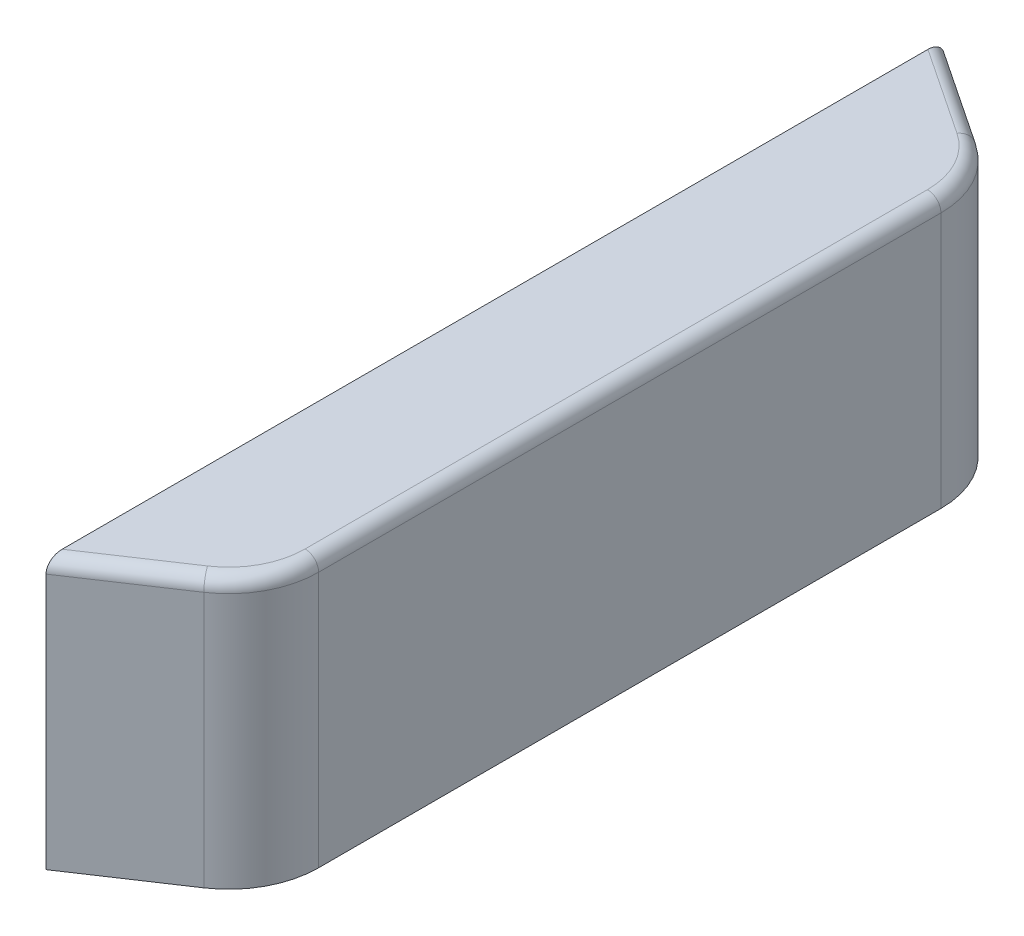
ISO-10303-21;
HEADER;
FILE_DESCRIPTION(('STEP AP214'),'2;1');
FILE_NAME('part.step','',(''),(''),'','','');
FILE_SCHEMA(('AUTOMOTIVE_DESIGN { 1 0 10303 214 1 1 1 1 }'));
ENDSEC;
DATA;
#1=APPLICATION_CONTEXT('core data for automotive mechanical design processes');
#2=APPLICATION_PROTOCOL_DEFINITION('international standard','automotive_design',2000,#1);
#3=PRODUCT_CONTEXT('',#1,'mechanical');
#4=PRODUCT('Part','Part','',(#3));
#5=PRODUCT_RELATED_PRODUCT_CATEGORY('part','',(#4));
#6=PRODUCT_DEFINITION_FORMATION('','',#4);
#7=PRODUCT_DEFINITION_CONTEXT('part definition',#1,'design');
#8=PRODUCT_DEFINITION('design','',#6,#7);
#9=PRODUCT_DEFINITION_SHAPE('','',#8);
#10=(LENGTH_UNIT() NAMED_UNIT(*) SI_UNIT(.MILLI.,.METRE.));
#11=(NAMED_UNIT(*) PLANE_ANGLE_UNIT() SI_UNIT($,.RADIAN.));
#12=(NAMED_UNIT(*) SI_UNIT($,.STERADIAN.) SOLID_ANGLE_UNIT());
#13=UNCERTAINTY_MEASURE_WITH_UNIT(LENGTH_MEASURE(1.E-05),#10,'distance_accuracy_value','');
#14=(GEOMETRIC_REPRESENTATION_CONTEXT(3) GLOBAL_UNCERTAINTY_ASSIGNED_CONTEXT((#13)) GLOBAL_UNIT_ASSIGNED_CONTEXT((#10,
#11,#12)) REPRESENTATION_CONTEXT('',''));
#15=CARTESIAN_POINT('',(0.,0.,0.));
#16=DIRECTION('',(0.,0.,1.));
#17=DIRECTION('',(1.,0.,0.));
#18=AXIS2_PLACEMENT_3D('',#15,#16,#17);
#19=CARTESIAN_POINT('',(4.99999999999999,0.,-34.64816241512));
#20=DIRECTION('',(0.,-1.,0.));
#21=DIRECTION('',(0.,0.,-1.));
#22=AXIS2_PLACEMENT_3D('',#19,#20,#21);
#23=PLANE('',#22);
#24=DIRECTION('',(-0.832050294337844,0.,-0.554700196225229));
#25=VECTOR('',#24,1.);
#26=CARTESIAN_POINT('',(0.,0.,-50.));
#27=LINE('',#26,#25);
#28=CARTESIAN_POINT('',(10.5470019622523,0.,-42.9686653584985));
#29=VERTEX_POINT('',#28);
#30=CARTESIAN_POINT('',(0.,0.,-50.));
#31=VERTEX_POINT('',#30);
#32=EDGE_CURVE('E217',#29,#31,#27,.T.);
#33=ORIENTED_EDGE('',*,*,#32,.F.);
#34=CARTESIAN_POINT('',(4.99999999999999,0.,-34.64816241512));
#35=DIRECTION('',(0.,1.,0.));
#36=DIRECTION('',(0.,0.,-1.));
#37=AXIS2_PLACEMENT_3D('',#34,#35,#36);
#38=CIRCLE('',#37,10.);
#39=CARTESIAN_POINT('',(15.,0.,-34.64816241512));
#40=VERTEX_POINT('',#39);
#41=EDGE_CURVE('E216',#40,#29,#38,.T.);
#42=ORIENTED_EDGE('',*,*,#41,.F.);
#43=DIRECTION('',(0.,0.,-1.));
#44=VECTOR('',#43,1.);
#45=CARTESIAN_POINT('',(15.,0.,34.64816241512));
#46=LINE('',#45,#44);
#47=CARTESIAN_POINT('',(15.,0.,34.64816241512));
#48=VERTEX_POINT('',#47);
#49=EDGE_CURVE('E230',#48,#40,#46,.T.);
#50=ORIENTED_EDGE('',*,*,#49,.F.);
#51=CARTESIAN_POINT('',(5.,0.,34.64816241512));
#52=DIRECTION('',(0.,1.,0.));
#53=DIRECTION('',(0.,0.,1.));
#54=AXIS2_PLACEMENT_3D('',#51,#52,#53);
#55=CIRCLE('',#54,10.);
#56=CARTESIAN_POINT('',(10.5470019622523,0.,42.9686653584985));
#57=VERTEX_POINT('',#56);
#58=EDGE_CURVE('E227',#57,#48,#55,.T.);
#59=ORIENTED_EDGE('',*,*,#58,.F.);
#60=DIRECTION('',(0.832050294337844,0.,-0.554700196225228));
#61=VECTOR('',#60,1.);
#62=CARTESIAN_POINT('',(10.5470019622523,0.,42.9686653584985));
#63=LINE('',#62,#61);
#64=CARTESIAN_POINT('',(0.,0.,50.));
#65=VERTEX_POINT('',#64);
#66=EDGE_CURVE('E224',#65,#57,#63,.T.);
#67=ORIENTED_EDGE('',*,*,#66,.F.);
#68=DIRECTION('',(0.,0.,1.));
#69=VECTOR('',#68,1.);
#70=CARTESIAN_POINT('',(0.,0.,50.));
#71=LINE('',#70,#69);
#72=EDGE_CURVE('E220',#31,#65,#71,.T.);
#73=ORIENTED_EDGE('',*,*,#72,.F.);
#74=EDGE_LOOP('',(#33,#42,#50,#59,#67,#73));
#75=FACE_BOUND('',#74,.T.);
#76=CARTESIAN_POINT('',(4.99999999999999,0.,-34.64816241512));
#77=DIRECTION('',(0.,-1.,0.));
#78=DIRECTION('',(0.,0.,-1.));
#79=AXIS2_PLACEMENT_3D('',#76,#77,#78);
#80=CIRCLE('',#79,8.50000000000001);
#81=CARTESIAN_POINT('',(13.5,0.,-34.64816241512));
#82=VERTEX_POINT('',#81);
#83=CARTESIAN_POINT('',(9.71495166791444,0.,-41.7205899169917));
#84=VERTEX_POINT('',#83);
#85=EDGE_CURVE('E180',#82,#84,#80,.F.);
#86=ORIENTED_EDGE('',*,*,#85,.T.);
#87=DIRECTION('',(-0.832050294337844,0.,-0.554700196225229));
#88=VECTOR('',#87,1.);
#89=CARTESIAN_POINT('',(9.71495166791444,0.,-41.7205899169917));
#90=LINE('',#89,#88);
#91=CARTESIAN_POINT('',(4.60940039245046,0.,-45.124290767301));
#92=VERTEX_POINT('',#91);
#93=EDGE_CURVE('E189',#84,#92,#90,.T.);
#94=ORIENTED_EDGE('',*,*,#93,.T.);
#95=CARTESIAN_POINT('',(3.5,0.,-43.4601901786254));
#96=DIRECTION('',(0.,-1.,0.));
#97=DIRECTION('',(0.,0.,-1.));
#98=AXIS2_PLACEMENT_3D('',#95,#96,#97);
#99=CIRCLE('',#98,2.);
#100=CARTESIAN_POINT('',(1.5,0.,-43.4601901786254));
#101=VERTEX_POINT('',#100);
#102=EDGE_CURVE('E278',#92,#101,#99,.F.);
#103=ORIENTED_EDGE('',*,*,#102,.T.);
#104=DIRECTION('',(0.,0.,1.));
#105=VECTOR('',#104,1.);
#106=CARTESIAN_POINT('',(1.5,0.,-34.64816241512));
#107=LINE('',#106,#105);
#108=CARTESIAN_POINT('',(1.5,0.,43.4601901786253));
#109=VERTEX_POINT('',#108);
#110=EDGE_CURVE('E195',#101,#109,#107,.T.);
#111=ORIENTED_EDGE('',*,*,#110,.T.);
#112=CARTESIAN_POINT('',(3.5,0.,43.4601901786254));
#113=DIRECTION('',(0.,-1.,0.));
#114=DIRECTION('',(0.,0.,-1.));
#115=AXIS2_PLACEMENT_3D('',#112,#113,#114);
#116=CIRCLE('',#115,2.);
#117=CARTESIAN_POINT('',(4.60940039245045,0.,45.1242907673011));
#118=VERTEX_POINT('',#117);
#119=EDGE_CURVE('E280',#109,#118,#116,.F.);
#120=ORIENTED_EDGE('',*,*,#119,.T.);
#121=DIRECTION('',(0.832050294337844,0.,-0.554700196225228));
#122=VECTOR('',#121,1.);
#123=CARTESIAN_POINT('',(41.6978708203329,0.,20.3986438153795));
#124=LINE('',#123,#122);
#125=CARTESIAN_POINT('',(9.71495166791446,0.,41.7205899169917));
#126=VERTEX_POINT('',#125);
#127=EDGE_CURVE('E207',#118,#126,#124,.T.);
#128=ORIENTED_EDGE('',*,*,#127,.T.);
#129=CARTESIAN_POINT('',(5.,0.,34.64816241512));
#130=DIRECTION('',(0.,-1.,0.));
#131=DIRECTION('',(0.,0.,-1.));
#132=AXIS2_PLACEMENT_3D('',#129,#130,#131);
#133=CIRCLE('',#132,8.50000000000001);
#134=CARTESIAN_POINT('',(13.5,0.,34.64816241512));
#135=VERTEX_POINT('',#134);
#136=EDGE_CURVE('E202',#126,#135,#133,.F.);
#137=ORIENTED_EDGE('',*,*,#136,.T.);
#138=DIRECTION('',(0.,0.,-1.));
#139=VECTOR('',#138,1.);
#140=CARTESIAN_POINT('',(13.5,0.,-34.64816241512));
#141=LINE('',#140,#139);
#142=EDGE_CURVE('E200',#135,#82,#141,.T.);
#143=ORIENTED_EDGE('',*,*,#142,.T.);
#144=EDGE_LOOP('',(#86,#94,#103,#111,#120,#128,#137,#143));
#145=FACE_BOUND('',#144,.T.);
#146=ADVANCED_FACE('F37',(#75,#145),#23,.T.);
#147=CARTESIAN_POINT('',(0.,30.,-50.));
#148=DIRECTION('',(-0.554700196225229,0.,0.832050294337844));
#149=DIRECTION('',(0.832050294337844,0.,0.554700196225229));
#150=AXIS2_PLACEMENT_3D('',#147,#148,#149);
#151=PLANE('',#150);
#152=DIRECTION('',(0.,-1.,0.));
#153=VECTOR('',#152,1.);
#154=CARTESIAN_POINT('',(0.,30.,-50.));
#155=LINE('',#154,#153);
#156=CARTESIAN_POINT('',(0.,28.5,-50.));
#157=VERTEX_POINT('',#156);
#158=EDGE_CURVE('E244',#157,#31,#155,.T.);
#159=ORIENTED_EDGE('',*,*,#158,.F.);
#160=DIRECTION('',(-0.832050294337844,0.,-0.554700196225229));
#161=VECTOR('',#160,1.);
#162=CARTESIAN_POINT('',(0.,28.5,-50.));
#163=LINE('',#162,#161);
#164=CARTESIAN_POINT('',(10.5470019622523,28.5,-42.9686653584985));
#165=VERTEX_POINT('',#164);
#166=EDGE_CURVE('E61',#157,#165,#163,.F.);
#167=ORIENTED_EDGE('',*,*,#166,.T.);
#168=DIRECTION('',(0.,-1.,0.));
#169=VECTOR('',#168,1.);
#170=CARTESIAN_POINT('',(10.5470019622523,30.,-42.9686653584985));
#171=LINE('',#170,#169);
#172=EDGE_CURVE('E215',#165,#29,#171,.T.);
#173=ORIENTED_EDGE('',*,*,#172,.T.);
#174=ORIENTED_EDGE('',*,*,#32,.T.);
#175=EDGE_LOOP('',(#159,#167,#173,#174));
#176=FACE_BOUND('',#175,.T.);
#177=ADVANCED_FACE('F382',(#176),#151,.F.);
#178=CARTESIAN_POINT('',(0.,30.,50.));
#179=DIRECTION('',(1.,0.,0.));
#180=DIRECTION('',(0.,0.,-1.));
#181=AXIS2_PLACEMENT_3D('',#178,#179,#180);
#182=PLANE('',#181);
#183=DIRECTION('',(0.,-1.,0.));
#184=VECTOR('',#183,1.);
#185=CARTESIAN_POINT('',(0.,30.,50.));
#186=LINE('',#185,#184);
#187=CARTESIAN_POINT('',(0.,28.5,50.));
#188=VERTEX_POINT('',#187);
#189=EDGE_CURVE('E242',#188,#65,#186,.T.);
#190=ORIENTED_EDGE('',*,*,#189,.F.);
#191=CARTESIAN_POINT('',(0.,28.5,48.197224362268));
#192=DIRECTION('',(1.,0.,0.));
#193=DIRECTION('',(0.,0.,-1.));
#194=AXIS2_PLACEMENT_3D('',#191,#192,#193);
#195=ELLIPSE('',#194,1.80277563773199,1.5);
#196=CARTESIAN_POINT('',(0.,30.,48.197224362268));
#197=VERTEX_POINT('',#196);
#198=EDGE_CURVE('E324',#188,#197,#195,.F.);
#199=ORIENTED_EDGE('',*,*,#198,.T.);
#200=DIRECTION('',(0.,0.,1.));
#201=VECTOR('',#200,1.);
#202=CARTESIAN_POINT('',(0.,30.,50.));
#203=LINE('',#202,#201);
#204=CARTESIAN_POINT('',(0.,30.,-48.197224362268));
#205=VERTEX_POINT('',#204);
#206=EDGE_CURVE('E212',#205,#197,#203,.T.);
#207=ORIENTED_EDGE('',*,*,#206,.F.);
#208=CARTESIAN_POINT('',(0.,28.5,-48.197224362268));
#209=DIRECTION('',(1.,0.,0.));
#210=DIRECTION('',(0.,0.,-1.));
#211=AXIS2_PLACEMENT_3D('',#208,#209,#210);
#212=ELLIPSE('',#211,1.80277563773199,1.5);
#213=EDGE_CURVE('E322',#205,#157,#212,.F.);
#214=ORIENTED_EDGE('',*,*,#213,.T.);
#215=ORIENTED_EDGE('',*,*,#158,.T.);
#216=ORIENTED_EDGE('',*,*,#72,.T.);
#217=EDGE_LOOP('',(#190,#199,#207,#214,#215,#216));
#218=FACE_BOUND('',#217,.T.);
#219=ADVANCED_FACE('F354',(#218),#182,.F.);
#220=CARTESIAN_POINT('',(10.5470019622523,30.,42.9686653584985));
#221=DIRECTION('',(-0.554700196225228,0.,-0.832050294337844));
#222=DIRECTION('',(-0.832050294337844,0.,0.554700196225228));
#223=AXIS2_PLACEMENT_3D('',#220,#221,#222);
#224=PLANE('',#223);
#225=DIRECTION('',(0.,-1.,0.));
#226=VECTOR('',#225,1.);
#227=CARTESIAN_POINT('',(10.5470019622523,30.,42.9686653584985));
#228=LINE('',#227,#226);
#229=CARTESIAN_POINT('',(10.5470019622523,28.5,42.9686653584985));
#230=VERTEX_POINT('',#229);
#231=EDGE_CURVE('E240',#230,#57,#228,.T.);
#232=ORIENTED_EDGE('',*,*,#231,.F.);
#233=DIRECTION('',(0.832050294337844,0.,-0.554700196225228));
#234=VECTOR('',#233,1.);
#235=CARTESIAN_POINT('',(10.5470019622523,28.5,42.9686653584985));
#236=LINE('',#235,#234);
#237=EDGE_CURVE('E320',#230,#188,#236,.F.);
#238=ORIENTED_EDGE('',*,*,#237,.T.);
#239=ORIENTED_EDGE('',*,*,#189,.T.);
#240=ORIENTED_EDGE('',*,*,#66,.T.);
#241=EDGE_LOOP('',(#232,#238,#239,#240));
#242=FACE_BOUND('',#241,.T.);
#243=ADVANCED_FACE('F371',(#242),#224,.F.);
#244=CARTESIAN_POINT('',(5.,30.,34.64816241512));
#245=DIRECTION('',(0.,-1.,0.));
#246=DIRECTION('',(0.,0.,-1.));
#247=AXIS2_PLACEMENT_3D('',#244,#245,#246);
#248=CYLINDRICAL_SURFACE('',#247,10.);
#249=DIRECTION('',(0.,-1.,0.));
#250=VECTOR('',#249,1.);
#251=CARTESIAN_POINT('',(15.,30.,34.64816241512));
#252=LINE('',#251,#250);
#253=CARTESIAN_POINT('',(15.,28.5,34.64816241512));
#254=VERTEX_POINT('',#253);
#255=EDGE_CURVE('E238',#254,#48,#252,.T.);
#256=ORIENTED_EDGE('',*,*,#255,.F.);
#257=CARTESIAN_POINT('',(5.,28.5,34.64816241512));
#258=DIRECTION('',(0.,-1.,0.));
#259=DIRECTION('',(0.,0.,-1.));
#260=AXIS2_PLACEMENT_3D('',#257,#258,#259);
#261=CIRCLE('',#260,10.);
#262=EDGE_CURVE('E326',#254,#230,#261,.T.);
#263=ORIENTED_EDGE('',*,*,#262,.T.);
#264=ORIENTED_EDGE('',*,*,#231,.T.);
#265=ORIENTED_EDGE('',*,*,#58,.T.);
#266=EDGE_LOOP('',(#256,#263,#264,#265));
#267=FACE_BOUND('',#266,.T.);
#268=ADVANCED_FACE('F369',(#267),#248,.T.);
#269=CARTESIAN_POINT('',(15.,30.,34.64816241512));
#270=DIRECTION('',(-1.,0.,0.));
#271=DIRECTION('',(0.,0.,1.));
#272=AXIS2_PLACEMENT_3D('',#269,#270,#271);
#273=PLANE('',#272);
#274=DIRECTION('',(0.,-1.,0.));
#275=VECTOR('',#274,1.);
#276=CARTESIAN_POINT('',(15.,30.,-34.64816241512));
#277=LINE('',#276,#275);
#278=CARTESIAN_POINT('',(15.,28.5,-34.64816241512));
#279=VERTEX_POINT('',#278);
#280=EDGE_CURVE('E236',#279,#40,#277,.T.);
#281=ORIENTED_EDGE('',*,*,#280,.F.);
#282=DIRECTION('',(0.,0.,-1.));
#283=VECTOR('',#282,1.);
#284=CARTESIAN_POINT('',(15.,28.5,34.64816241512));
#285=LINE('',#284,#283);
#286=EDGE_CURVE('E11',#279,#254,#285,.F.);
#287=ORIENTED_EDGE('',*,*,#286,.T.);
#288=ORIENTED_EDGE('',*,*,#255,.T.);
#289=ORIENTED_EDGE('',*,*,#49,.T.);
#290=EDGE_LOOP('',(#281,#287,#288,#289));
#291=FACE_BOUND('',#290,.T.);
#292=ADVANCED_FACE('F380',(#291),#273,.F.);
#293=CARTESIAN_POINT('',(4.99999999999999,30.,-34.64816241512));
#294=DIRECTION('',(0.,-1.,0.));
#295=DIRECTION('',(0.,0.,-1.));
#296=AXIS2_PLACEMENT_3D('',#293,#294,#295);
#297=CYLINDRICAL_SURFACE('',#296,10.);
#298=ORIENTED_EDGE('',*,*,#172,.F.);
#299=CARTESIAN_POINT('',(4.99999999999999,28.5,-34.64816241512));
#300=DIRECTION('',(0.,-1.,0.));
#301=DIRECTION('',(0.,0.,-1.));
#302=AXIS2_PLACEMENT_3D('',#299,#300,#301);
#303=CIRCLE('',#302,10.);
#304=EDGE_CURVE('E46',#165,#279,#303,.T.);
#305=ORIENTED_EDGE('',*,*,#304,.T.);
#306=ORIENTED_EDGE('',*,*,#280,.T.);
#307=ORIENTED_EDGE('',*,*,#41,.T.);
#308=EDGE_LOOP('',(#298,#305,#306,#307));
#309=FACE_BOUND('',#308,.T.);
#310=ADVANCED_FACE('F381',(#309),#297,.T.);
#311=CARTESIAN_POINT('',(4.99999999999999,30.,-34.64816241512));
#312=DIRECTION('',(0.,-1.,0.));
#313=DIRECTION('',(0.,0.,-1.));
#314=AXIS2_PLACEMENT_3D('',#311,#312,#313);
#315=PLANE('',#314);
#316=ORIENTED_EDGE('',*,*,#206,.T.);
#317=DIRECTION('',(0.832050294337844,0.,-0.554700196225228));
#318=VECTOR('',#317,1.);
#319=CARTESIAN_POINT('',(41.6978708203329,30.,20.3986438153795));
#320=LINE('',#319,#318);
#321=CARTESIAN_POINT('',(9.71495166791446,30.,41.7205899169917));
#322=VERTEX_POINT('',#321);
#323=EDGE_CURVE('E317',#197,#322,#320,.T.);
#324=ORIENTED_EDGE('',*,*,#323,.T.);
#325=CARTESIAN_POINT('',(5.,30.,34.64816241512));
#326=DIRECTION('',(0.,-1.,0.));
#327=DIRECTION('',(0.,0.,-1.));
#328=AXIS2_PLACEMENT_3D('',#325,#326,#327);
#329=CIRCLE('',#328,8.50000000000001);
#330=CARTESIAN_POINT('',(13.5,30.,34.64816241512));
#331=VERTEX_POINT('',#330);
#332=EDGE_CURVE('E315',#322,#331,#329,.F.);
#333=ORIENTED_EDGE('',*,*,#332,.T.);
#334=DIRECTION('',(0.,0.,-1.));
#335=VECTOR('',#334,1.);
#336=CARTESIAN_POINT('',(13.5,30.,-34.64816241512));
#337=LINE('',#336,#335);
#338=CARTESIAN_POINT('',(13.5,30.,-34.64816241512));
#339=VERTEX_POINT('',#338);
#340=EDGE_CURVE('E282',#331,#339,#337,.T.);
#341=ORIENTED_EDGE('',*,*,#340,.T.);
#342=CARTESIAN_POINT('',(4.99999999999999,30.,-34.64816241512));
#343=DIRECTION('',(0.,-1.,0.));
#344=DIRECTION('',(0.,0.,-1.));
#345=AXIS2_PLACEMENT_3D('',#342,#343,#344);
#346=CIRCLE('',#345,8.50000000000001);
#347=CARTESIAN_POINT('',(9.71495166791444,30.,-41.7205899169917));
#348=VERTEX_POINT('',#347);
#349=EDGE_CURVE('E311',#339,#348,#346,.F.);
#350=ORIENTED_EDGE('',*,*,#349,.T.);
#351=DIRECTION('',(-0.832050294337844,0.,-0.554700196225229));
#352=VECTOR('',#351,1.);
#353=CARTESIAN_POINT('',(9.71495166791444,30.,-41.7205899169917));
#354=LINE('',#353,#352);
#355=EDGE_CURVE('E313',#348,#205,#354,.T.);
#356=ORIENTED_EDGE('',*,*,#355,.T.);
#357=EDGE_LOOP('',(#316,#324,#333,#341,#350,#356));
#358=FACE_BOUND('',#357,.T.);
#359=ADVANCED_FACE('F350',(#358),#315,.F.);
#360=CARTESIAN_POINT('',(-0.832050294337844,30.,-48.7519245584932));
#361=DIRECTION('',(-0.554700196225229,0.,0.832050294337844));
#362=DIRECTION('',(0.832050294337844,0.,0.554700196225229));
#363=AXIS2_PLACEMENT_3D('',#360,#361,#362);
#364=PLANE('',#363);
#365=DIRECTION('',(0.,1.,0.));
#366=VECTOR('',#365,1.);
#367=CARTESIAN_POINT('',(9.71495166791445,30.,-41.7205899169917));
#368=LINE('',#367,#366);
#369=CARTESIAN_POINT('',(9.71495166791445,26.5,-41.7205899169917));
#370=VERTEX_POINT('',#369);
#371=EDGE_CURVE('E175',#370,#84,#368,.F.);
#372=ORIENTED_EDGE('',*,*,#371,.F.);
#373=DIRECTION('',(-0.832050294337844,0.,-0.554700196225229));
#374=VECTOR('',#373,1.);
#375=CARTESIAN_POINT('',(1.5,26.5,-47.197224362268));
#376=LINE('',#375,#374);
#377=CARTESIAN_POINT('',(4.60940039245046,26.5,-45.124290767301));
#378=VERTEX_POINT('',#377);
#379=EDGE_CURVE('E276',#370,#378,#376,.T.);
#380=ORIENTED_EDGE('',*,*,#379,.T.);
#381=DIRECTION('',(0.,-1.,0.));
#382=VECTOR('',#381,1.);
#383=CARTESIAN_POINT('',(4.60940039245046,0.,-45.124290767301));
#384=LINE('',#383,#382);
#385=EDGE_CURVE('E192',#378,#92,#384,.T.);
#386=ORIENTED_EDGE('',*,*,#385,.T.);
#387=ORIENTED_EDGE('',*,*,#93,.F.);
#388=EDGE_LOOP('',(#372,#380,#386,#387));
#389=FACE_BOUND('',#388,.T.);
#390=ADVANCED_FACE('F190',(#389),#364,.T.);
#391=CARTESIAN_POINT('',(1.5,30.,50.));
#392=DIRECTION('',(1.,0.,0.));
#393=DIRECTION('',(0.,0.,-1.));
#394=AXIS2_PLACEMENT_3D('',#391,#392,#393);
#395=PLANE('',#394);
#396=ORIENTED_EDGE('',*,*,#110,.F.);
#397=DIRECTION('',(0.,-1.,0.));
#398=VECTOR('',#397,1.);
#399=CARTESIAN_POINT('',(1.5,28.5,-43.4601901786254));
#400=LINE('',#399,#398);
#401=CARTESIAN_POINT('',(1.5,26.5,-43.4601901786254));
#402=VERTEX_POINT('',#401);
#403=EDGE_CURVE('E251',#101,#402,#400,.F.);
#404=ORIENTED_EDGE('',*,*,#403,.T.);
#405=DIRECTION('',(0.,0.,1.));
#406=VECTOR('',#405,1.);
#407=CARTESIAN_POINT('',(1.5,26.5,47.197224362268));
#408=LINE('',#407,#406);
#409=CARTESIAN_POINT('',(1.5,26.5,43.4601901786254));
#410=VERTEX_POINT('',#409);
#411=EDGE_CURVE('E248',#402,#410,#408,.T.);
#412=ORIENTED_EDGE('',*,*,#411,.T.);
#413=DIRECTION('',(0.,-1.,0.));
#414=VECTOR('',#413,1.);
#415=CARTESIAN_POINT('',(1.5,0.,43.4601901786254));
#416=LINE('',#415,#414);
#417=EDGE_CURVE('E246',#410,#109,#416,.T.);
#418=ORIENTED_EDGE('',*,*,#417,.T.);
#419=EDGE_LOOP('',(#396,#404,#412,#418));
#420=FACE_BOUND('',#419,.T.);
#421=ADVANCED_FACE('F522',(#420),#395,.T.);
#422=CARTESIAN_POINT('',(9.71495166791446,30.,41.7205899169917));
#423=DIRECTION('',(-0.554700196225228,0.,-0.832050294337844));
#424=DIRECTION('',(-0.832050294337844,0.,0.554700196225228));
#425=AXIS2_PLACEMENT_3D('',#422,#423,#424);
#426=PLANE('',#425);
#427=DIRECTION('',(0.,-1.,0.));
#428=VECTOR('',#427,1.);
#429=CARTESIAN_POINT('',(4.60940039245046,28.5,45.124290767301));
#430=LINE('',#429,#428);
#431=CARTESIAN_POINT('',(4.60940039245046,26.5,45.124290767301));
#432=VERTEX_POINT('',#431);
#433=EDGE_CURVE('E266',#118,#432,#430,.F.);
#434=ORIENTED_EDGE('',*,*,#433,.T.);
#435=DIRECTION('',(0.832050294337844,0.,-0.554700196225228));
#436=VECTOR('',#435,1.);
#437=CARTESIAN_POINT('',(9.71495166791446,26.5,41.7205899169917));
#438=LINE('',#437,#436);
#439=CARTESIAN_POINT('',(9.71495166791446,26.5,41.7205899169917));
#440=VERTEX_POINT('',#439);
#441=EDGE_CURVE('E268',#432,#440,#438,.T.);
#442=ORIENTED_EDGE('',*,*,#441,.T.);
#443=DIRECTION('',(0.,-1.,0.));
#444=VECTOR('',#443,1.);
#445=CARTESIAN_POINT('',(9.71495166791446,30.,41.7205899169917));
#446=LINE('',#445,#444);
#447=EDGE_CURVE('E221',#440,#126,#446,.T.);
#448=ORIENTED_EDGE('',*,*,#447,.T.);
#449=ORIENTED_EDGE('',*,*,#127,.F.);
#450=EDGE_LOOP('',(#434,#442,#448,#449));
#451=FACE_BOUND('',#450,.T.);
#452=ADVANCED_FACE('F514',(#451),#426,.T.);
#453=CARTESIAN_POINT('',(5.,30.,34.64816241512));
#454=DIRECTION('',(0.,-1.,0.));
#455=DIRECTION('',(0.,0.,-1.));
#456=AXIS2_PLACEMENT_3D('',#453,#454,#455);
#457=CYLINDRICAL_SURFACE('',#456,8.50000000000001);
#458=ORIENTED_EDGE('',*,*,#447,.F.);
#459=CARTESIAN_POINT('',(5.,26.5,34.64816241512));
#460=DIRECTION('',(0.,-1.,0.));
#461=DIRECTION('',(0.,0.,-1.));
#462=AXIS2_PLACEMENT_3D('',#459,#460,#461);
#463=CIRCLE('',#462,8.50000000000001);
#464=CARTESIAN_POINT('',(13.5,26.5,34.64816241512));
#465=VERTEX_POINT('',#464);
#466=EDGE_CURVE('E270',#440,#465,#463,.F.);
#467=ORIENTED_EDGE('',*,*,#466,.T.);
#468=DIRECTION('',(0.,1.,0.));
#469=VECTOR('',#468,1.);
#470=CARTESIAN_POINT('',(13.5,30.,34.64816241512));
#471=LINE('',#470,#469);
#472=EDGE_CURVE('E730',#465,#135,#471,.F.);
#473=ORIENTED_EDGE('',*,*,#472,.T.);
#474=ORIENTED_EDGE('',*,*,#136,.F.);
#475=EDGE_LOOP('',(#458,#467,#473,#474));
#476=FACE_BOUND('',#475,.T.);
#477=ADVANCED_FACE('F506',(#476),#457,.F.);
#478=CARTESIAN_POINT('',(13.5,30.,34.64816241512));
#479=DIRECTION('',(-1.,0.,0.));
#480=DIRECTION('',(0.,0.,1.));
#481=AXIS2_PLACEMENT_3D('',#478,#479,#480);
#482=PLANE('',#481);
#483=ORIENTED_EDGE('',*,*,#472,.F.);
#484=DIRECTION('',(0.,0.,-1.));
#485=VECTOR('',#484,1.);
#486=CARTESIAN_POINT('',(13.5,26.5,-34.64816241512));
#487=LINE('',#486,#485);
#488=CARTESIAN_POINT('',(13.5,26.5,-34.64816241512));
#489=VERTEX_POINT('',#488);
#490=EDGE_CURVE('E272',#465,#489,#487,.T.);
#491=ORIENTED_EDGE('',*,*,#490,.T.);
#492=DIRECTION('',(0.,-1.,0.));
#493=VECTOR('',#492,1.);
#494=CARTESIAN_POINT('',(13.5,30.,-34.64816241512));
#495=LINE('',#494,#493);
#496=EDGE_CURVE('E186',#489,#82,#495,.T.);
#497=ORIENTED_EDGE('',*,*,#496,.T.);
#498=ORIENTED_EDGE('',*,*,#142,.F.);
#499=EDGE_LOOP('',(#483,#491,#497,#498));
#500=FACE_BOUND('',#499,.T.);
#501=ADVANCED_FACE('F499',(#500),#482,.T.);
#502=CARTESIAN_POINT('',(4.99999999999999,30.,-34.64816241512));
#503=DIRECTION('',(0.,-1.,0.));
#504=DIRECTION('',(0.,0.,-1.));
#505=AXIS2_PLACEMENT_3D('',#502,#503,#504);
#506=CYLINDRICAL_SURFACE('',#505,8.50000000000001);
#507=ORIENTED_EDGE('',*,*,#496,.F.);
#508=CARTESIAN_POINT('',(4.99999999999999,26.5,-34.64816241512));
#509=DIRECTION('',(0.,-1.,0.));
#510=DIRECTION('',(0.,0.,-1.));
#511=AXIS2_PLACEMENT_3D('',#508,#509,#510);
#512=CIRCLE('',#511,8.50000000000001);
#513=EDGE_CURVE('E183',#489,#370,#512,.F.);
#514=ORIENTED_EDGE('',*,*,#513,.T.);
#515=ORIENTED_EDGE('',*,*,#371,.T.);
#516=ORIENTED_EDGE('',*,*,#85,.F.);
#517=EDGE_LOOP('',(#507,#514,#515,#516));
#518=FACE_BOUND('',#517,.T.);
#519=ADVANCED_FACE('F178',(#518),#506,.F.);
#520=CARTESIAN_POINT('',(4.99999999999999,28.5,-34.64816241512));
#521=DIRECTION('',(0.,-1.,0.));
#522=DIRECTION('',(0.,0.,-1.));
#523=AXIS2_PLACEMENT_3D('',#520,#521,#522);
#524=PLANE('',#523);
#525=DIRECTION('',(0.832050294337844,0.,-0.554700196225228));
#526=VECTOR('',#525,1.);
#527=CARTESIAN_POINT('',(0.390599607549542,28.5,45.5331237735923));
#528=LINE('',#527,#526);
#529=CARTESIAN_POINT('',(8.605551275464,28.5,40.056489328316));
#530=VERTEX_POINT('',#529);
#531=CARTESIAN_POINT('',(3.5,28.5,43.4601901786253));
#532=VERTEX_POINT('',#531);
#533=EDGE_CURVE('E261',#530,#532,#528,.F.);
#534=ORIENTED_EDGE('',*,*,#533,.T.);
#535=DIRECTION('',(0.,0.,1.));
#536=VECTOR('',#535,1.);
#537=CARTESIAN_POINT('',(3.5,28.5,-47.197224362268));
#538=LINE('',#537,#536);
#539=CARTESIAN_POINT('',(3.5,28.5,-43.4601901786254));
#540=VERTEX_POINT('',#539);
#541=EDGE_CURVE('E263',#532,#540,#538,.F.);
#542=ORIENTED_EDGE('',*,*,#541,.T.);
#543=DIRECTION('',(-0.832050294337844,0.,-0.554700196225229));
#544=VECTOR('',#543,1.);
#545=CARTESIAN_POINT('',(8.60555127546399,28.5,-40.056489328316));
#546=LINE('',#545,#544);
#547=CARTESIAN_POINT('',(8.60555127546399,28.5,-40.056489328316));
#548=VERTEX_POINT('',#547);
#549=EDGE_CURVE('E253',#540,#548,#546,.F.);
#550=ORIENTED_EDGE('',*,*,#549,.T.);
#551=CARTESIAN_POINT('',(4.99999999999999,28.5,-34.64816241512));
#552=DIRECTION('',(0.,-1.,0.));
#553=DIRECTION('',(0.,0.,-1.));
#554=AXIS2_PLACEMENT_3D('',#551,#552,#553);
#555=CIRCLE('',#554,6.50000000000001);
#556=CARTESIAN_POINT('',(11.5,28.5,-34.64816241512));
#557=VERTEX_POINT('',#556);
#558=EDGE_CURVE('E255',#548,#557,#555,.T.);
#559=ORIENTED_EDGE('',*,*,#558,.T.);
#560=DIRECTION('',(0.,0.,-1.));
#561=VECTOR('',#560,1.);
#562=CARTESIAN_POINT('',(11.5,28.5,34.64816241512));
#563=LINE('',#562,#561);
#564=CARTESIAN_POINT('',(11.5,28.5,34.64816241512));
#565=VERTEX_POINT('',#564);
#566=EDGE_CURVE('E257',#557,#565,#563,.F.);
#567=ORIENTED_EDGE('',*,*,#566,.T.);
#568=CARTESIAN_POINT('',(5.,28.5,34.64816241512));
#569=DIRECTION('',(0.,-1.,0.));
#570=DIRECTION('',(0.,0.,-1.));
#571=AXIS2_PLACEMENT_3D('',#568,#569,#570);
#572=CIRCLE('',#571,6.50000000000001);
#573=EDGE_CURVE('E259',#565,#530,#572,.T.);
#574=ORIENTED_EDGE('',*,*,#573,.T.);
#575=EDGE_LOOP('',(#534,#542,#550,#559,#567,#574));
#576=FACE_BOUND('',#575,.T.);
#577=ADVANCED_FACE('F432',(#576),#524,.T.);
#578=CARTESIAN_POINT('',(11.5,26.5,34.64816241512));
#579=DIRECTION('',(0.,0.,1.));
#580=DIRECTION('',(1.,0.,0.));
#581=AXIS2_PLACEMENT_3D('',#578,#579,#580);
#582=CYLINDRICAL_SURFACE('',#581,2.);
#583=CARTESIAN_POINT('',(11.5,26.5,34.64816241512));
#584=DIRECTION('',(0.,0.,-1.));
#585=DIRECTION('',(-1.,0.,0.));
#586=AXIS2_PLACEMENT_3D('',#583,#584,#585);
#587=CIRCLE('',#586,2.);
#588=EDGE_CURVE('E305',#565,#465,#587,.T.);
#589=ORIENTED_EDGE('',*,*,#588,.F.);
#590=ORIENTED_EDGE('',*,*,#566,.F.);
#591=CARTESIAN_POINT('',(11.5,26.5,-34.64816241512));
#592=DIRECTION('',(0.,0.,1.));
#593=DIRECTION('',(1.,0.,0.));
#594=AXIS2_PLACEMENT_3D('',#591,#592,#593);
#595=CIRCLE('',#594,2.);
#596=EDGE_CURVE('E196',#489,#557,#595,.T.);
#597=ORIENTED_EDGE('',*,*,#596,.F.);
#598=ORIENTED_EDGE('',*,*,#490,.F.);
#599=EDGE_LOOP('',(#589,#590,#597,#598));
#600=FACE_BOUND('',#599,.T.);
#601=ADVANCED_FACE('F428',(#600),#582,.F.);
#602=CARTESIAN_POINT('',(4.99999999999999,26.5,-34.64816241512));
#603=DIRECTION('',(0.,-1.,0.));
#604=DIRECTION('',(0.,0.,-1.));
#605=AXIS2_PLACEMENT_3D('',#602,#603,#604);
#606=TOROIDAL_SURFACE('',#605,6.50000000000001,2.);
#607=ORIENTED_EDGE('',*,*,#596,.T.);
#608=ORIENTED_EDGE('',*,*,#558,.F.);
#609=CARTESIAN_POINT('',(8.60555127546398,26.5,-40.056489328316));
#610=DIRECTION('',(0.832050294337843,0.,0.55470019622523));
#611=DIRECTION('',(0.55470019622523,0.,-0.832050294337843));
#612=AXIS2_PLACEMENT_3D('',#609,#610,#611);
#613=CIRCLE('',#612,2.);
#614=EDGE_CURVE('E302',#370,#548,#613,.T.);
#615=ORIENTED_EDGE('',*,*,#614,.F.);
#616=ORIENTED_EDGE('',*,*,#513,.F.);
#617=EDGE_LOOP('',(#607,#608,#615,#616));
#618=FACE_BOUND('',#617,.T.);
#619=ADVANCED_FACE('F424',(#618),#606,.F.);
#620=CARTESIAN_POINT('',(5.,26.5,34.64816241512));
#621=DIRECTION('',(0.,-1.,0.));
#622=DIRECTION('',(0.,0.,-1.));
#623=AXIS2_PLACEMENT_3D('',#620,#621,#622);
#624=TOROIDAL_SURFACE('',#623,6.50000000000001,2.);
#625=ORIENTED_EDGE('',*,*,#588,.T.);
#626=ORIENTED_EDGE('',*,*,#466,.F.);
#627=CARTESIAN_POINT('',(8.605551275464,26.5,40.056489328316));
#628=DIRECTION('',(0.832050294337844,0.,-0.554700196225229));
#629=DIRECTION('',(-0.554700196225229,0.,-0.832050294337844));
#630=AXIS2_PLACEMENT_3D('',#627,#628,#629);
#631=CIRCLE('',#630,2.);
#632=EDGE_CURVE('E299',#530,#440,#631,.T.);
#633=ORIENTED_EDGE('',*,*,#632,.F.);
#634=ORIENTED_EDGE('',*,*,#573,.F.);
#635=EDGE_LOOP('',(#625,#626,#633,#634));
#636=FACE_BOUND('',#635,.T.);
#637=ADVANCED_FACE('F420',(#636),#624,.F.);
#638=CARTESIAN_POINT('',(-1.9414506867883,26.5,-47.0878239698176));
#639=DIRECTION('',(0.832050294337844,0.,0.554700196225229));
#640=DIRECTION('',(0.554700196225229,0.,-0.832050294337844));
#641=AXIS2_PLACEMENT_3D('',#638,#639,#640);
#642=CYLINDRICAL_SURFACE('',#641,2.);
#643=ORIENTED_EDGE('',*,*,#614,.T.);
#644=ORIENTED_EDGE('',*,*,#549,.F.);
#645=CARTESIAN_POINT('',(3.5,26.5,-43.4601901786254));
#646=DIRECTION('',(0.832050294337843,0.,0.554700196225229));
#647=DIRECTION('',(0.554700196225229,0.,-0.832050294337844));
#648=AXIS2_PLACEMENT_3D('',#645,#646,#647);
#649=CIRCLE('',#648,2.);
#650=EDGE_CURVE('E296',#378,#540,#649,.T.);
#651=ORIENTED_EDGE('',*,*,#650,.F.);
#652=ORIENTED_EDGE('',*,*,#379,.F.);
#653=EDGE_LOOP('',(#643,#644,#651,#652));
#654=FACE_BOUND('',#653,.T.);
#655=ADVANCED_FACE('F416',(#654),#642,.F.);
#656=CARTESIAN_POINT('',(3.5,30.,-43.4601901786254));
#657=DIRECTION('',(0.,1.,0.));
#658=DIRECTION('',(0.,0.,1.));
#659=AXIS2_PLACEMENT_3D('',#656,#657,#658);
#660=CYLINDRICAL_SURFACE('',#659,2.);
#661=ORIENTED_EDGE('',*,*,#102,.F.);
#662=ORIENTED_EDGE('',*,*,#385,.F.);
#663=CARTESIAN_POINT('',(3.5,26.5,-43.4601901786254));
#664=DIRECTION('',(0.,-1.,0.));
#665=DIRECTION('',(0.,0.,-1.));
#666=AXIS2_PLACEMENT_3D('',#663,#664,#665);
#667=CIRCLE('',#666,2.);
#668=EDGE_CURVE('E293',#402,#378,#667,.T.);
#669=ORIENTED_EDGE('',*,*,#668,.F.);
#670=ORIENTED_EDGE('',*,*,#403,.F.);
#671=EDGE_LOOP('',(#661,#662,#669,#670));
#672=FACE_BOUND('',#671,.T.);
#673=ADVANCED_FACE('F412',(#672),#660,.F.);
#674=CARTESIAN_POINT('',(3.5,30.,43.4601901786254));
#675=DIRECTION('',(0.,1.,0.));
#676=DIRECTION('',(0.,0.,1.));
#677=AXIS2_PLACEMENT_3D('',#674,#675,#676);
#678=CYLINDRICAL_SURFACE('',#677,2.);
#679=ORIENTED_EDGE('',*,*,#119,.F.);
#680=ORIENTED_EDGE('',*,*,#417,.F.);
#681=CARTESIAN_POINT('',(3.5,26.5,43.4601901786254));
#682=DIRECTION('',(0.,-1.,0.));
#683=DIRECTION('',(0.,0.,-1.));
#684=AXIS2_PLACEMENT_3D('',#681,#682,#683);
#685=CIRCLE('',#684,2.);
#686=EDGE_CURVE('E290',#432,#410,#685,.T.);
#687=ORIENTED_EDGE('',*,*,#686,.F.);
#688=ORIENTED_EDGE('',*,*,#433,.F.);
#689=EDGE_LOOP('',(#679,#680,#687,#688));
#690=FACE_BOUND('',#689,.T.);
#691=ADVANCED_FACE('F408',(#690),#678,.F.);
#692=CARTESIAN_POINT('',(8.60555127546401,26.5,40.056489328316));
#693=DIRECTION('',(-0.832050294337844,0.,0.554700196225228));
#694=DIRECTION('',(0.554700196225228,0.,0.832050294337844));
#695=AXIS2_PLACEMENT_3D('',#692,#693,#694);
#696=CYLINDRICAL_SURFACE('',#695,2.);
#697=ORIENTED_EDGE('',*,*,#632,.T.);
#698=ORIENTED_EDGE('',*,*,#441,.F.);
#699=CARTESIAN_POINT('',(3.5,26.5,43.4601901786253));
#700=DIRECTION('',(0.832050294337845,0.,-0.554700196225226));
#701=DIRECTION('',(-0.554700196225226,0.,-0.832050294337846));
#702=AXIS2_PLACEMENT_3D('',#699,#700,#701);
#703=CIRCLE('',#702,2.);
#704=EDGE_CURVE('E287',#532,#432,#703,.T.);
#705=ORIENTED_EDGE('',*,*,#704,.F.);
#706=ORIENTED_EDGE('',*,*,#533,.F.);
#707=EDGE_LOOP('',(#697,#698,#705,#706));
#708=FACE_BOUND('',#707,.T.);
#709=ADVANCED_FACE('F404',(#708),#696,.F.);
#710=CARTESIAN_POINT('',(3.5,26.5,-43.4601901786254));
#711=DIRECTION('',(0.,1.,0.));
#712=DIRECTION('',(-1.,0.,0.));
#713=AXIS2_PLACEMENT_3D('',#710,#711,#712);
#714=SPHERICAL_SURFACE('',#713,2.);
#715=ORIENTED_EDGE('',*,*,#668,.T.);
#716=ORIENTED_EDGE('',*,*,#650,.T.);
#717=CARTESIAN_POINT('',(3.5,26.5,-43.4601901786254));
#718=DIRECTION('',(0.,0.,1.));
#719=DIRECTION('',(1.,0.,0.));
#720=AXIS2_PLACEMENT_3D('',#717,#718,#719);
#721=CIRCLE('',#720,2.);
#722=EDGE_CURVE('E285',#402,#540,#721,.F.);
#723=ORIENTED_EDGE('',*,*,#722,.F.);
#724=EDGE_LOOP('',(#715,#716,#723));
#725=FACE_BOUND('',#724,.T.);
#726=ADVANCED_FACE('F400',(#725),#714,.F.);
#727=CARTESIAN_POINT('',(3.5,26.5,43.4601901786254));
#728=DIRECTION('',(0.,1.,0.));
#729=DIRECTION('',(0.,0.,1.));
#730=AXIS2_PLACEMENT_3D('',#727,#728,#729);
#731=SPHERICAL_SURFACE('',#730,2.);
#732=ORIENTED_EDGE('',*,*,#704,.T.);
#733=ORIENTED_EDGE('',*,*,#686,.T.);
#734=CARTESIAN_POINT('',(3.5,26.5,43.4601901786254));
#735=DIRECTION('',(0.,0.,-1.));
#736=DIRECTION('',(0.,1.,0.));
#737=AXIS2_PLACEMENT_3D('',#734,#735,#736);
#738=CIRCLE('',#737,2.);
#739=EDGE_CURVE('E283',#532,#410,#738,.F.);
#740=ORIENTED_EDGE('',*,*,#739,.F.);
#741=EDGE_LOOP('',(#732,#733,#740));
#742=FACE_BOUND('',#741,.T.);
#743=ADVANCED_FACE('F396',(#742),#731,.F.);
#744=CARTESIAN_POINT('',(3.5,26.5,50.));
#745=DIRECTION('',(0.,0.,-1.));
#746=DIRECTION('',(-1.,0.,0.));
#747=AXIS2_PLACEMENT_3D('',#744,#745,#746);
#748=CYLINDRICAL_SURFACE('',#747,2.);
#749=ORIENTED_EDGE('',*,*,#722,.T.);
#750=ORIENTED_EDGE('',*,*,#541,.F.);
#751=ORIENTED_EDGE('',*,*,#739,.T.);
#752=ORIENTED_EDGE('',*,*,#411,.F.);
#753=EDGE_LOOP('',(#749,#750,#751,#752));
#754=FACE_BOUND('',#753,.T.);
#755=ADVANCED_FACE('F393',(#754),#748,.F.);
#756=CARTESIAN_POINT('',(9.71495166791444,28.5,-41.7205899169917));
#757=DIRECTION('',(-0.832050294337844,0.,-0.554700196225229));
#758=DIRECTION('',(-0.554700196225229,0.,0.832050294337844));
#759=AXIS2_PLACEMENT_3D('',#756,#757,#758);
#760=CYLINDRICAL_SURFACE('',#759,1.5);
#761=ORIENTED_EDGE('',*,*,#213,.F.);
#762=ORIENTED_EDGE('',*,*,#355,.F.);
#763=CARTESIAN_POINT('',(9.71495166791445,28.5,-41.7205899169917));
#764=DIRECTION('',(0.832050294337843,0.,0.55470019622523));
#765=DIRECTION('',(0.55470019622523,0.,-0.832050294337843));
#766=AXIS2_PLACEMENT_3D('',#763,#764,#765);
#767=CIRCLE('',#766,1.5);
#768=EDGE_CURVE('E41',#165,#348,#767,.T.);
#769=ORIENTED_EDGE('',*,*,#768,.F.);
#770=ORIENTED_EDGE('',*,*,#166,.F.);
#771=EDGE_LOOP('',(#761,#762,#769,#770));
#772=FACE_BOUND('',#771,.T.);
#773=ADVANCED_FACE('F39',(#772),#760,.T.);
#774=CARTESIAN_POINT('',(4.99999999999999,28.5,-34.64816241512));
#775=DIRECTION('',(0.,-1.,0.));
#776=DIRECTION('',(0.,0.,-1.));
#777=AXIS2_PLACEMENT_3D('',#774,#775,#776);
#778=TOROIDAL_SURFACE('',#777,8.50000000000001,1.5);
#779=ORIENTED_EDGE('',*,*,#768,.T.);
#780=ORIENTED_EDGE('',*,*,#349,.F.);
#781=CARTESIAN_POINT('',(13.5,28.5,-34.64816241512));
#782=DIRECTION('',(0.,0.,1.));
#783=DIRECTION('',(1.,0.,0.));
#784=AXIS2_PLACEMENT_3D('',#781,#782,#783);
#785=CIRCLE('',#784,1.5);
#786=EDGE_CURVE('E334',#279,#339,#785,.T.);
#787=ORIENTED_EDGE('',*,*,#786,.F.);
#788=ORIENTED_EDGE('',*,*,#304,.F.);
#789=EDGE_LOOP('',(#779,#780,#787,#788));
#790=FACE_BOUND('',#789,.T.);
#791=ADVANCED_FACE('F344',(#790),#778,.T.);
#792=CARTESIAN_POINT('',(13.5,28.5,-34.64816241512));
#793=DIRECTION('',(0.,0.,-1.));
#794=DIRECTION('',(-1.,0.,0.));
#795=AXIS2_PLACEMENT_3D('',#792,#793,#794);
#796=CYLINDRICAL_SURFACE('',#795,1.5);
#797=ORIENTED_EDGE('',*,*,#786,.T.);
#798=ORIENTED_EDGE('',*,*,#340,.F.);
#799=CARTESIAN_POINT('',(13.5,28.5,34.64816241512));
#800=DIRECTION('',(0.,0.,1.));
#801=DIRECTION('',(1.,0.,0.));
#802=AXIS2_PLACEMENT_3D('',#799,#800,#801);
#803=CIRCLE('',#802,1.5);
#804=EDGE_CURVE('E332',#254,#331,#803,.T.);
#805=ORIENTED_EDGE('',*,*,#804,.F.);
#806=ORIENTED_EDGE('',*,*,#286,.F.);
#807=EDGE_LOOP('',(#797,#798,#805,#806));
#808=FACE_BOUND('',#807,.T.);
#809=ADVANCED_FACE('F363',(#808),#796,.T.);
#810=CARTESIAN_POINT('',(5.,28.5,34.64816241512));
#811=DIRECTION('',(0.,-1.,0.));
#812=DIRECTION('',(0.,0.,-1.));
#813=AXIS2_PLACEMENT_3D('',#810,#811,#812);
#814=TOROIDAL_SURFACE('',#813,8.50000000000001,1.5);
#815=ORIENTED_EDGE('',*,*,#804,.T.);
#816=ORIENTED_EDGE('',*,*,#332,.F.);
#817=CARTESIAN_POINT('',(9.71495166791446,28.5,41.7205899169917));
#818=DIRECTION('',(-0.832050294337843,0.,0.55470019622523));
#819=DIRECTION('',(0.55470019622523,0.,0.832050294337843));
#820=AXIS2_PLACEMENT_3D('',#817,#818,#819);
#821=CIRCLE('',#820,1.5);
#822=EDGE_CURVE('E330',#230,#322,#821,.T.);
#823=ORIENTED_EDGE('',*,*,#822,.F.);
#824=ORIENTED_EDGE('',*,*,#262,.F.);
#825=EDGE_LOOP('',(#815,#816,#823,#824));
#826=FACE_BOUND('',#825,.T.);
#827=ADVANCED_FACE('F365',(#826),#814,.T.);
#828=CARTESIAN_POINT('',(41.6978708203329,28.5,20.3986438153795));
#829=DIRECTION('',(0.832050294337844,0.,-0.554700196225228));
#830=DIRECTION('',(-0.554700196225228,0.,-0.832050294337844));
#831=AXIS2_PLACEMENT_3D('',#828,#829,#830);
#832=CYLINDRICAL_SURFACE('',#831,1.5);
#833=ORIENTED_EDGE('',*,*,#198,.F.);
#834=ORIENTED_EDGE('',*,*,#237,.F.);
#835=ORIENTED_EDGE('',*,*,#822,.T.);
#836=ORIENTED_EDGE('',*,*,#323,.F.);
#837=EDGE_LOOP('',(#833,#834,#835,#836));
#838=FACE_BOUND('',#837,.T.);
#839=ADVANCED_FACE('F358',(#838),#832,.T.);
#840=CLOSED_SHELL('',(#146,#177,#219,#243,#268,#292,#310,#359,#390,#421,#452,#477,#501,#519,
#577,#601,#619,#637,#655,#673,#691,#709,#726,#743,#755,#773,#791,#809,#827,#839));
#841=MANIFOLD_SOLID_BREP('B2',#840);
#842=ADVANCED_BREP_SHAPE_REPRESENTATION('',(#18,#841),#14);
#843=SHAPE_DEFINITION_REPRESENTATION(#9,#842);
ENDSEC;
END-ISO-10303-21;
